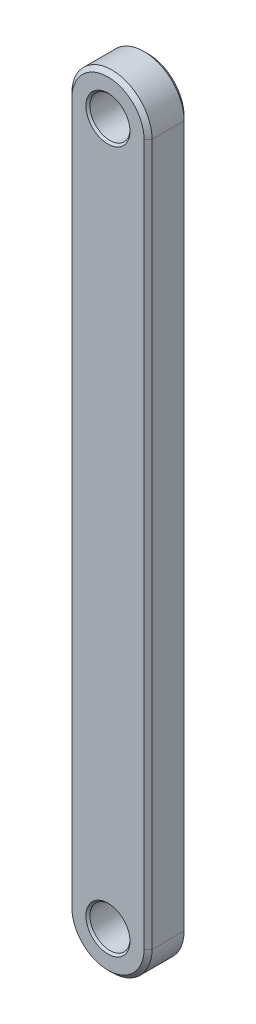
ISO-10303-21;
HEADER;
FILE_DESCRIPTION(('STEP AP214'),'2;1');
FILE_NAME('part.step','',(''),(''),'','','');
FILE_SCHEMA(('AUTOMOTIVE_DESIGN { 1 0 10303 214 1 1 1 1 }'));
ENDSEC;
DATA;
#1=APPLICATION_CONTEXT('core data for automotive mechanical design processes');
#2=APPLICATION_PROTOCOL_DEFINITION('international standard','automotive_design',2000,#1);
#3=PRODUCT_CONTEXT('',#1,'mechanical');
#4=PRODUCT('Part','Part','',(#3));
#5=PRODUCT_RELATED_PRODUCT_CATEGORY('part','',(#4));
#6=PRODUCT_DEFINITION_FORMATION('','',#4);
#7=PRODUCT_DEFINITION_CONTEXT('part definition',#1,'design');
#8=PRODUCT_DEFINITION('design','',#6,#7);
#9=PRODUCT_DEFINITION_SHAPE('','',#8);
#10=(LENGTH_UNIT() NAMED_UNIT(*) SI_UNIT(.MILLI.,.METRE.));
#11=(NAMED_UNIT(*) PLANE_ANGLE_UNIT() SI_UNIT($,.RADIAN.));
#12=(NAMED_UNIT(*) SI_UNIT($,.STERADIAN.) SOLID_ANGLE_UNIT());
#13=UNCERTAINTY_MEASURE_WITH_UNIT(LENGTH_MEASURE(1.E-05),#10,'distance_accuracy_value','');
#14=(GEOMETRIC_REPRESENTATION_CONTEXT(3) GLOBAL_UNCERTAINTY_ASSIGNED_CONTEXT((#13)) GLOBAL_UNIT_ASSIGNED_CONTEXT((#10,
#11,#12)) REPRESENTATION_CONTEXT('',''));
#15=CARTESIAN_POINT('',(0.,0.,0.));
#16=DIRECTION('',(0.,0.,1.));
#17=DIRECTION('',(1.,0.,0.));
#18=AXIS2_PLACEMENT_3D('',#15,#16,#17);
#19=CARTESIAN_POINT('',(0.,-17.5,1.));
#20=DIRECTION('',(0.,0.,1.));
#21=DIRECTION('',(1.,0.,0.));
#22=AXIS2_PLACEMENT_3D('',#19,#20,#21);
#23=PLANE('',#22);
#24=CARTESIAN_POINT('',(0.,-17.5,1.));
#25=DIRECTION('',(0.,0.,1.));
#26=DIRECTION('',(1.,0.,0.));
#27=AXIS2_PLACEMENT_3D('',#24,#25,#26);
#28=CIRCLE('',#27,1.1);
#29=CARTESIAN_POINT('',(1.1,-17.5,1.));
#30=VERTEX_POINT('',#29);
#31=EDGE_CURVE('E160',#30,#30,#28,.F.);
#32=ORIENTED_EDGE('',*,*,#31,.T.);
#33=EDGE_LOOP('',(#32));
#34=FACE_BOUND('',#33,.T.);
#35=CARTESIAN_POINT('',(0.,17.5,1.));
#36=DIRECTION('',(0.,0.,1.));
#37=DIRECTION('',(1.,0.,0.));
#38=AXIS2_PLACEMENT_3D('',#35,#36,#37);
#39=CIRCLE('',#38,1.1);
#40=CARTESIAN_POINT('',(1.1,17.5,1.));
#41=VERTEX_POINT('',#40);
#42=EDGE_CURVE('E157',#41,#41,#39,.F.);
#43=ORIENTED_EDGE('',*,*,#42,.T.);
#44=EDGE_LOOP('',(#43));
#45=FACE_BOUND('',#44,.T.);
#46=CARTESIAN_POINT('',(0.,17.5,1.));
#47=DIRECTION('',(0.,0.,1.));
#48=DIRECTION('',(1.,0.,0.));
#49=AXIS2_PLACEMENT_3D('',#46,#47,#48);
#50=CIRCLE('',#49,1.80000000000001);
#51=CARTESIAN_POINT('',(1.8,17.5,1.));
#52=VERTEX_POINT('',#51);
#53=CARTESIAN_POINT('',(-1.80000000000001,17.5,1.));
#54=VERTEX_POINT('',#53);
#55=EDGE_CURVE('E63',#52,#54,#50,.T.);
#56=ORIENTED_EDGE('',*,*,#55,.T.);
#57=DIRECTION('',(0.,-1.,0.));
#58=VECTOR('',#57,1.);
#59=CARTESIAN_POINT('',(-1.80000000000001,-17.5,1.));
#60=LINE('',#59,#58);
#61=CARTESIAN_POINT('',(-1.80000000000001,-17.5,1.));
#62=VERTEX_POINT('',#61);
#63=EDGE_CURVE('E154',#54,#62,#60,.T.);
#64=ORIENTED_EDGE('',*,*,#63,.T.);
#65=CARTESIAN_POINT('',(0.,-17.5,1.));
#66=DIRECTION('',(0.,0.,1.));
#67=DIRECTION('',(1.,0.,0.));
#68=AXIS2_PLACEMENT_3D('',#65,#66,#67);
#69=CIRCLE('',#68,1.80000000000001);
#70=CARTESIAN_POINT('',(1.80000000000001,-17.5,1.));
#71=VERTEX_POINT('',#70);
#72=EDGE_CURVE('E138',#62,#71,#69,.T.);
#73=ORIENTED_EDGE('',*,*,#72,.T.);
#74=DIRECTION('',(0.,1.,0.));
#75=VECTOR('',#74,1.);
#76=CARTESIAN_POINT('',(1.8,17.5,1.));
#77=LINE('',#76,#75);
#78=EDGE_CURVE('E323',#71,#52,#77,.T.);
#79=ORIENTED_EDGE('',*,*,#78,.T.);
#80=EDGE_LOOP('',(#56,#64,#73,#79));
#81=FACE_BOUND('',#80,.T.);
#82=ADVANCED_FACE('F39',(#34,#45,#81),#23,.T.);
#83=CARTESIAN_POINT('',(0.,-17.5,-1.));
#84=DIRECTION('',(0.,0.,1.));
#85=DIRECTION('',(1.,0.,0.));
#86=AXIS2_PLACEMENT_3D('',#83,#84,#85);
#87=PLANE('',#86);
#88=CARTESIAN_POINT('',(0.,-17.5,-1.));
#89=DIRECTION('',(0.,0.,1.));
#90=DIRECTION('',(1.,0.,0.));
#91=AXIS2_PLACEMENT_3D('',#88,#89,#90);
#92=CIRCLE('',#91,1.1);
#93=CARTESIAN_POINT('',(1.1,-17.5,-1.));
#94=VERTEX_POINT('',#93);
#95=EDGE_CURVE('E166',#94,#94,#92,.T.);
#96=ORIENTED_EDGE('',*,*,#95,.T.);
#97=EDGE_LOOP('',(#96));
#98=FACE_BOUND('',#97,.T.);
#99=CARTESIAN_POINT('',(0.,17.5,-1.));
#100=DIRECTION('',(0.,0.,1.));
#101=DIRECTION('',(1.,0.,0.));
#102=AXIS2_PLACEMENT_3D('',#99,#100,#101);
#103=CIRCLE('',#102,1.1);
#104=CARTESIAN_POINT('',(1.1,17.5,-1.));
#105=VERTEX_POINT('',#104);
#106=EDGE_CURVE('E163',#105,#105,#103,.T.);
#107=ORIENTED_EDGE('',*,*,#106,.T.);
#108=EDGE_LOOP('',(#107));
#109=FACE_BOUND('',#108,.T.);
#110=CARTESIAN_POINT('',(0.,-17.5,-1.));
#111=DIRECTION('',(0.,0.,1.));
#112=DIRECTION('',(1.,0.,0.));
#113=AXIS2_PLACEMENT_3D('',#110,#111,#112);
#114=CIRCLE('',#113,1.80000000000001);
#115=CARTESIAN_POINT('',(1.80000000000001,-17.5,-1.));
#116=VERTEX_POINT('',#115);
#117=CARTESIAN_POINT('',(-1.80000000000001,-17.5,-1.));
#118=VERTEX_POINT('',#117);
#119=EDGE_CURVE('E287',#116,#118,#114,.F.);
#120=ORIENTED_EDGE('',*,*,#119,.T.);
#121=DIRECTION('',(0.,1.,0.));
#122=VECTOR('',#121,1.);
#123=CARTESIAN_POINT('',(-1.80000000000001,-17.5,-1.));
#124=LINE('',#123,#122);
#125=CARTESIAN_POINT('',(-1.80000000000001,17.5,-1.));
#126=VERTEX_POINT('',#125);
#127=EDGE_CURVE('E119',#118,#126,#124,.T.);
#128=ORIENTED_EDGE('',*,*,#127,.T.);
#129=CARTESIAN_POINT('',(0.,17.5,-1.));
#130=DIRECTION('',(0.,0.,1.));
#131=DIRECTION('',(1.,0.,0.));
#132=AXIS2_PLACEMENT_3D('',#129,#130,#131);
#133=CIRCLE('',#132,1.80000000000001);
#134=CARTESIAN_POINT('',(1.8,17.5,-1.));
#135=VERTEX_POINT('',#134);
#136=EDGE_CURVE('E294',#126,#135,#133,.F.);
#137=ORIENTED_EDGE('',*,*,#136,.T.);
#138=DIRECTION('',(0.,-1.,0.));
#139=VECTOR('',#138,1.);
#140=CARTESIAN_POINT('',(1.80000000000001,-17.5,-1.));
#141=LINE('',#140,#139);
#142=EDGE_CURVE('E290',#135,#116,#141,.T.);
#143=ORIENTED_EDGE('',*,*,#142,.T.);
#144=EDGE_LOOP('',(#120,#128,#137,#143));
#145=FACE_BOUND('',#144,.T.);
#146=ADVANCED_FACE('F183',(#98,#109,#145),#87,.F.);
#147=CARTESIAN_POINT('',(0.,-17.5,1.));
#148=DIRECTION('',(0.,0.,-1.));
#149=DIRECTION('',(-1.,0.,0.));
#150=AXIS2_PLACEMENT_3D('',#147,#148,#149);
#151=CYLINDRICAL_SURFACE('',#150,2.00000000000001);
#152=DIRECTION('',(0.,0.,-1.));
#153=VECTOR('',#152,1.);
#154=CARTESIAN_POINT('',(-2.00000000000001,-17.5,1.));
#155=LINE('',#154,#153);
#156=CARTESIAN_POINT('',(-2.00000000000001,-17.5,0.799999999999998));
#157=VERTEX_POINT('',#156);
#158=CARTESIAN_POINT('',(-2.00000000000001,-17.5,-0.799999999999998));
#159=VERTEX_POINT('',#158);
#160=EDGE_CURVE('E112',#157,#159,#155,.T.);
#161=ORIENTED_EDGE('',*,*,#160,.T.);
#162=CARTESIAN_POINT('',(0.,-17.5,-0.799999999999998));
#163=DIRECTION('',(0.,0.,1.));
#164=DIRECTION('',(1.,0.,0.));
#165=AXIS2_PLACEMENT_3D('',#162,#163,#164);
#166=CIRCLE('',#165,2.00000000000001);
#167=CARTESIAN_POINT('',(2.00000000000001,-17.5,-0.799999999999998));
#168=VERTEX_POINT('',#167);
#169=EDGE_CURVE('E118',#159,#168,#166,.T.);
#170=ORIENTED_EDGE('',*,*,#169,.T.);
#171=DIRECTION('',(0.,0.,-1.));
#172=VECTOR('',#171,1.);
#173=CARTESIAN_POINT('',(2.00000000000001,-17.5,1.));
#174=LINE('',#173,#172);
#175=CARTESIAN_POINT('',(2.00000000000001,-17.5,0.799999999999998));
#176=VERTEX_POINT('',#175);
#177=EDGE_CURVE('E114',#176,#168,#174,.T.);
#178=ORIENTED_EDGE('',*,*,#177,.F.);
#179=CARTESIAN_POINT('',(0.,-17.5,0.799999999999998));
#180=DIRECTION('',(0.,0.,1.));
#181=DIRECTION('',(1.,0.,0.));
#182=AXIS2_PLACEMENT_3D('',#179,#180,#181);
#183=CIRCLE('',#182,2.00000000000001);
#184=EDGE_CURVE('E109',#176,#157,#183,.F.);
#185=ORIENTED_EDGE('',*,*,#184,.T.);
#186=EDGE_LOOP('',(#161,#170,#178,#185));
#187=FACE_BOUND('',#186,.T.);
#188=ADVANCED_FACE('F111',(#187),#151,.T.);
#189=CARTESIAN_POINT('',(2.00000000000001,-17.5,1.));
#190=DIRECTION('',(-1.,0.,0.));
#191=DIRECTION('',(0.,-1.,0.));
#192=AXIS2_PLACEMENT_3D('',#189,#190,#191);
#193=PLANE('',#192);
#194=ORIENTED_EDGE('',*,*,#177,.T.);
#195=DIRECTION('',(0.,1.,0.));
#196=VECTOR('',#195,1.);
#197=CARTESIAN_POINT('',(2.00000000000001,-17.5,-0.799999999999998));
#198=LINE('',#197,#196);
#199=CARTESIAN_POINT('',(2.00000000000001,17.5,-0.799999999999998));
#200=VERTEX_POINT('',#199);
#201=EDGE_CURVE('E311',#168,#200,#198,.T.);
#202=ORIENTED_EDGE('',*,*,#201,.T.);
#203=DIRECTION('',(0.,0.,-1.));
#204=VECTOR('',#203,1.);
#205=CARTESIAN_POINT('',(2.00000000000001,17.5,1.));
#206=LINE('',#205,#204);
#207=CARTESIAN_POINT('',(2.00000000000001,17.5,0.799999999999998));
#208=VERTEX_POINT('',#207);
#209=EDGE_CURVE('E330',#208,#200,#206,.T.);
#210=ORIENTED_EDGE('',*,*,#209,.F.);
#211=DIRECTION('',(0.,-1.,0.));
#212=VECTOR('',#211,1.);
#213=CARTESIAN_POINT('',(2.00000000000001,-17.5,0.799999999999998));
#214=LINE('',#213,#212);
#215=EDGE_CURVE('E320',#208,#176,#214,.T.);
#216=ORIENTED_EDGE('',*,*,#215,.T.);
#217=EDGE_LOOP('',(#194,#202,#210,#216));
#218=FACE_BOUND('',#217,.T.);
#219=ADVANCED_FACE('F200',(#218),#193,.F.);
#220=CARTESIAN_POINT('',(0.,17.5,1.));
#221=DIRECTION('',(0.,0.,-1.));
#222=DIRECTION('',(-1.,0.,0.));
#223=AXIS2_PLACEMENT_3D('',#220,#221,#222);
#224=CYLINDRICAL_SURFACE('',#223,2.00000000000001);
#225=ORIENTED_EDGE('',*,*,#209,.T.);
#226=CARTESIAN_POINT('',(0.,17.5,-0.799999999999998));
#227=DIRECTION('',(0.,0.,1.));
#228=DIRECTION('',(1.,0.,0.));
#229=AXIS2_PLACEMENT_3D('',#226,#227,#228);
#230=CIRCLE('',#229,2.00000000000001);
#231=CARTESIAN_POINT('',(-2.00000000000001,17.5,-0.799999999999998));
#232=VERTEX_POINT('',#231);
#233=EDGE_CURVE('E309',#200,#232,#230,.T.);
#234=ORIENTED_EDGE('',*,*,#233,.T.);
#235=DIRECTION('',(0.,0.,-1.));
#236=VECTOR('',#235,1.);
#237=CARTESIAN_POINT('',(-2.00000000000001,17.5,1.));
#238=LINE('',#237,#236);
#239=CARTESIAN_POINT('',(-2.00000000000001,17.5,0.799999999999998));
#240=VERTEX_POINT('',#239);
#241=EDGE_CURVE('E130',#240,#232,#238,.T.);
#242=ORIENTED_EDGE('',*,*,#241,.F.);
#243=CARTESIAN_POINT('',(0.,17.5,0.799999999999998));
#244=DIRECTION('',(0.,0.,1.));
#245=DIRECTION('',(1.,0.,0.));
#246=AXIS2_PLACEMENT_3D('',#243,#244,#245);
#247=CIRCLE('',#246,2.00000000000001);
#248=EDGE_CURVE('E317',#240,#208,#247,.F.);
#249=ORIENTED_EDGE('',*,*,#248,.T.);
#250=EDGE_LOOP('',(#225,#234,#242,#249));
#251=FACE_BOUND('',#250,.T.);
#252=ADVANCED_FACE('F197',(#251),#224,.T.);
#253=CARTESIAN_POINT('',(-2.00000000000001,-17.5,1.));
#254=DIRECTION('',(1.,0.,0.));
#255=DIRECTION('',(0.,1.,0.));
#256=AXIS2_PLACEMENT_3D('',#253,#254,#255);
#257=PLANE('',#256);
#258=ORIENTED_EDGE('',*,*,#241,.T.);
#259=DIRECTION('',(0.,-1.,0.));
#260=VECTOR('',#259,1.);
#261=CARTESIAN_POINT('',(-2.00000000000001,-17.5,-0.799999999999998));
#262=LINE('',#261,#260);
#263=EDGE_CURVE('E129',#232,#159,#262,.T.);
#264=ORIENTED_EDGE('',*,*,#263,.T.);
#265=ORIENTED_EDGE('',*,*,#160,.F.);
#266=DIRECTION('',(0.,1.,0.));
#267=VECTOR('',#266,1.);
#268=CARTESIAN_POINT('',(-2.00000000000001,17.5,0.799999999999998));
#269=LINE('',#268,#267);
#270=EDGE_CURVE('E126',#157,#240,#269,.T.);
#271=ORIENTED_EDGE('',*,*,#270,.T.);
#272=EDGE_LOOP('',(#258,#264,#265,#271));
#273=FACE_BOUND('',#272,.T.);
#274=ADVANCED_FACE('F125',(#273),#257,.F.);
#275=CARTESIAN_POINT('',(0.,17.5,1.));
#276=DIRECTION('',(0.,0.,-1.));
#277=DIRECTION('',(-1.,0.,0.));
#278=AXIS2_PLACEMENT_3D('',#275,#276,#277);
#279=CYLINDRICAL_SURFACE('',#278,1.);
#280=CARTESIAN_POINT('',(0.,17.5,-0.899999999999998));
#281=DIRECTION('',(0.,0.,1.));
#282=DIRECTION('',(1.,0.,0.));
#283=AXIS2_PLACEMENT_3D('',#280,#281,#282);
#284=CIRCLE('',#283,1.);
#285=CARTESIAN_POINT('',(1.,17.5,-0.899999999999998));
#286=VERTEX_POINT('',#285);
#287=EDGE_CURVE('E11',#286,#286,#284,.F.);
#288=ORIENTED_EDGE('',*,*,#287,.T.);
#289=EDGE_LOOP('',(#288));
#290=FACE_BOUND('',#289,.T.);
#291=CARTESIAN_POINT('',(0.,17.5,0.900000000000005));
#292=DIRECTION('',(0.,0.,1.));
#293=DIRECTION('',(1.,0.,0.));
#294=AXIS2_PLACEMENT_3D('',#291,#292,#293);
#295=CIRCLE('',#294,1.);
#296=CARTESIAN_POINT('',(1.,17.5,0.900000000000005));
#297=VERTEX_POINT('',#296);
#298=EDGE_CURVE('E48',#297,#297,#295,.T.);
#299=ORIENTED_EDGE('',*,*,#298,.T.);
#300=EDGE_LOOP('',(#299));
#301=FACE_BOUND('',#300,.T.);
#302=ADVANCED_FACE('F171',(#290,#301),#279,.F.);
#303=CARTESIAN_POINT('',(0.,-17.5,1.));
#304=DIRECTION('',(0.,0.,-1.));
#305=DIRECTION('',(-1.,0.,0.));
#306=AXIS2_PLACEMENT_3D('',#303,#304,#305);
#307=CYLINDRICAL_SURFACE('',#306,1.);
#308=CARTESIAN_POINT('',(0.,-17.5,0.900000000000006));
#309=DIRECTION('',(0.,0.,1.));
#310=DIRECTION('',(1.,0.,0.));
#311=AXIS2_PLACEMENT_3D('',#308,#309,#310);
#312=CIRCLE('',#311,1.);
#313=CARTESIAN_POINT('',(1.,-17.5,0.900000000000006));
#314=VERTEX_POINT('',#313);
#315=EDGE_CURVE('E153',#314,#314,#312,.T.);
#316=ORIENTED_EDGE('',*,*,#315,.T.);
#317=EDGE_LOOP('',(#316));
#318=FACE_BOUND('',#317,.T.);
#319=CARTESIAN_POINT('',(0.,-17.5,-0.899999999999999));
#320=DIRECTION('',(0.,0.,1.));
#321=DIRECTION('',(1.,0.,0.));
#322=AXIS2_PLACEMENT_3D('',#319,#320,#321);
#323=CIRCLE('',#322,1.);
#324=CARTESIAN_POINT('',(1.,-17.5,-0.899999999999999));
#325=VERTEX_POINT('',#324);
#326=EDGE_CURVE('E150',#325,#325,#323,.F.);
#327=ORIENTED_EDGE('',*,*,#326,.T.);
#328=EDGE_LOOP('',(#327));
#329=FACE_BOUND('',#328,.T.);
#330=ADVANCED_FACE('F236',(#318,#329),#307,.F.);
#331=CARTESIAN_POINT('',(2.00000000000001,-17.5,-0.799999999999998));
#332=DIRECTION('',(-0.707106781186554,0.,0.707106781186541));
#333=DIRECTION('',(0.,1.,0.));
#334=AXIS2_PLACEMENT_3D('',#331,#332,#333);
#335=PLANE('',#334);
#336=DIRECTION('',(0.707106781186541,0.,0.707106781186554));
#337=VECTOR('',#336,1.);
#338=CARTESIAN_POINT('',(1.80000000000001,-17.5,-1.));
#339=LINE('',#338,#337);
#340=EDGE_CURVE('E302',#116,#168,#339,.T.);
#341=ORIENTED_EDGE('',*,*,#340,.F.);
#342=ORIENTED_EDGE('',*,*,#142,.F.);
#343=DIRECTION('',(-0.707106781186541,0.,-0.707106781186554));
#344=VECTOR('',#343,1.);
#345=CARTESIAN_POINT('',(2.,17.5,-0.799999999999998));
#346=LINE('',#345,#344);
#347=EDGE_CURVE('E131',#200,#135,#346,.T.);
#348=ORIENTED_EDGE('',*,*,#347,.F.);
#349=ORIENTED_EDGE('',*,*,#201,.F.);
#350=EDGE_LOOP('',(#341,#342,#348,#349));
#351=FACE_BOUND('',#350,.T.);
#352=ADVANCED_FACE('F230',(#351),#335,.F.);
#353=CARTESIAN_POINT('',(0.,17.5,-0.799999999999998));
#354=DIRECTION('',(0.,0.,1.));
#355=DIRECTION('',(1.,0.,0.));
#356=AXIS2_PLACEMENT_3D('',#353,#354,#355);
#357=CONICAL_SURFACE('',#356,2.00000000000001,0.78539816339744);
#358=ORIENTED_EDGE('',*,*,#347,.T.);
#359=ORIENTED_EDGE('',*,*,#136,.F.);
#360=DIRECTION('',(0.707106781186541,0.,-0.707106781186554));
#361=VECTOR('',#360,1.);
#362=CARTESIAN_POINT('',(-2.00000000000001,17.5,-0.799999999999998));
#363=LINE('',#362,#361);
#364=EDGE_CURVE('E298',#232,#126,#363,.T.);
#365=ORIENTED_EDGE('',*,*,#364,.F.);
#366=ORIENTED_EDGE('',*,*,#233,.F.);
#367=EDGE_LOOP('',(#358,#359,#365,#366));
#368=FACE_BOUND('',#367,.T.);
#369=ADVANCED_FACE('F223',(#368),#357,.T.);
#370=CARTESIAN_POINT('',(0.,-17.5,-0.799999999999998));
#371=DIRECTION('',(0.,0.,1.));
#372=DIRECTION('',(1.,0.,0.));
#373=AXIS2_PLACEMENT_3D('',#370,#371,#372);
#374=CONICAL_SURFACE('',#373,2.00000000000001,0.78539816339744);
#375=ORIENTED_EDGE('',*,*,#340,.T.);
#376=ORIENTED_EDGE('',*,*,#169,.F.);
#377=DIRECTION('',(-0.707106781186541,0.,0.707106781186554));
#378=VECTOR('',#377,1.);
#379=CARTESIAN_POINT('',(-1.80000000000001,-17.5,-1.));
#380=LINE('',#379,#378);
#381=EDGE_CURVE('E149',#118,#159,#380,.T.);
#382=ORIENTED_EDGE('',*,*,#381,.F.);
#383=ORIENTED_EDGE('',*,*,#119,.F.);
#384=EDGE_LOOP('',(#375,#376,#382,#383));
#385=FACE_BOUND('',#384,.T.);
#386=ADVANCED_FACE('F216',(#385),#374,.T.);
#387=CARTESIAN_POINT('',(-2.00000000000001,-17.5,-0.799999999999998));
#388=DIRECTION('',(0.707106781186554,0.,0.707106781186541));
#389=DIRECTION('',(0.,-1.,0.));
#390=AXIS2_PLACEMENT_3D('',#387,#388,#389);
#391=PLANE('',#390);
#392=ORIENTED_EDGE('',*,*,#364,.T.);
#393=ORIENTED_EDGE('',*,*,#127,.F.);
#394=ORIENTED_EDGE('',*,*,#381,.T.);
#395=ORIENTED_EDGE('',*,*,#263,.F.);
#396=EDGE_LOOP('',(#392,#393,#394,#395));
#397=FACE_BOUND('',#396,.T.);
#398=ADVANCED_FACE('F208',(#397),#391,.F.);
#399=CARTESIAN_POINT('',(1.80000000000001,-17.5,1.));
#400=DIRECTION('',(0.707106781186554,0.,0.707106781186541));
#401=DIRECTION('',(0.,-1.,0.));
#402=AXIS2_PLACEMENT_3D('',#399,#400,#401);
#403=PLANE('',#402);
#404=DIRECTION('',(-0.707106781186541,0.,0.707106781186554));
#405=VECTOR('',#404,1.);
#406=CARTESIAN_POINT('',(2.00000000000001,-17.5,0.799999999999998));
#407=LINE('',#406,#405);
#408=EDGE_CURVE('E140',#176,#71,#407,.T.);
#409=ORIENTED_EDGE('',*,*,#408,.F.);
#410=ORIENTED_EDGE('',*,*,#215,.F.);
#411=DIRECTION('',(0.707106781186541,0.,-0.707106781186554));
#412=VECTOR('',#411,1.);
#413=CARTESIAN_POINT('',(1.8,17.5,1.));
#414=LINE('',#413,#412);
#415=EDGE_CURVE('E146',#52,#208,#414,.T.);
#416=ORIENTED_EDGE('',*,*,#415,.F.);
#417=ORIENTED_EDGE('',*,*,#78,.F.);
#418=EDGE_LOOP('',(#409,#410,#416,#417));
#419=FACE_BOUND('',#418,.T.);
#420=ADVANCED_FACE('F215',(#419),#403,.T.);
#421=CARTESIAN_POINT('',(0.,17.5,1.));
#422=DIRECTION('',(0.,0.,-1.));
#423=DIRECTION('',(-1.,0.,0.));
#424=AXIS2_PLACEMENT_3D('',#421,#422,#423);
#425=CONICAL_SURFACE('',#424,1.80000000000001,0.78539816339744);
#426=ORIENTED_EDGE('',*,*,#415,.T.);
#427=ORIENTED_EDGE('',*,*,#248,.F.);
#428=DIRECTION('',(-0.707106781186541,0.,-0.707106781186554));
#429=VECTOR('',#428,1.);
#430=CARTESIAN_POINT('',(-1.80000000000001,17.5,1.));
#431=LINE('',#430,#429);
#432=EDGE_CURVE('E134',#54,#240,#431,.T.);
#433=ORIENTED_EDGE('',*,*,#432,.F.);
#434=ORIENTED_EDGE('',*,*,#55,.F.);
#435=EDGE_LOOP('',(#426,#427,#433,#434));
#436=FACE_BOUND('',#435,.T.);
#437=ADVANCED_FACE('F251',(#436),#425,.T.);
#438=CARTESIAN_POINT('',(0.,-17.5,1.));
#439=DIRECTION('',(0.,0.,-1.));
#440=DIRECTION('',(-1.,0.,0.));
#441=AXIS2_PLACEMENT_3D('',#438,#439,#440);
#442=CONICAL_SURFACE('',#441,1.80000000000001,0.78539816339744);
#443=ORIENTED_EDGE('',*,*,#408,.T.);
#444=ORIENTED_EDGE('',*,*,#72,.F.);
#445=DIRECTION('',(0.707106781186541,0.,0.707106781186554));
#446=VECTOR('',#445,1.);
#447=CARTESIAN_POINT('',(-2.00000000000001,-17.5,0.799999999999998));
#448=LINE('',#447,#446);
#449=EDGE_CURVE('E55',#157,#62,#448,.T.);
#450=ORIENTED_EDGE('',*,*,#449,.F.);
#451=ORIENTED_EDGE('',*,*,#184,.F.);
#452=EDGE_LOOP('',(#443,#444,#450,#451));
#453=FACE_BOUND('',#452,.T.);
#454=ADVANCED_FACE('F137',(#453),#442,.T.);
#455=CARTESIAN_POINT('',(-1.80000000000001,-17.5,1.));
#456=DIRECTION('',(-0.707106781186554,0.,0.707106781186541));
#457=DIRECTION('',(0.,1.,0.));
#458=AXIS2_PLACEMENT_3D('',#455,#456,#457);
#459=PLANE('',#458);
#460=ORIENTED_EDGE('',*,*,#432,.T.);
#461=ORIENTED_EDGE('',*,*,#270,.F.);
#462=ORIENTED_EDGE('',*,*,#449,.T.);
#463=ORIENTED_EDGE('',*,*,#63,.F.);
#464=EDGE_LOOP('',(#460,#461,#462,#463));
#465=FACE_BOUND('',#464,.T.);
#466=ADVANCED_FACE('F133',(#465),#459,.T.);
#467=CARTESIAN_POINT('',(0.,-17.5,0.900000000000006));
#468=DIRECTION('',(0.,0.,1.));
#469=DIRECTION('',(1.,0.,0.));
#470=AXIS2_PLACEMENT_3D('',#467,#468,#469);
#471=CONICAL_SURFACE('',#470,1.,0.785398163397457);
#472=CARTESIAN_POINT('',(1.1,-17.5,1.));
#473=CARTESIAN_POINT('',(1.09895833333333,-17.5,0.998958333333333));
#474=CARTESIAN_POINT('',(1.09791666666666,-17.5,0.997916666666667));
#475=CARTESIAN_POINT('',(1.09583333333333,-17.5,0.995833333333334));
#476=CARTESIAN_POINT('',(1.09479166666666,-17.5,0.994791666666667));
#477=CARTESIAN_POINT('',(1.09270833333333,-17.5,0.992708333333334));
#478=CARTESIAN_POINT('',(1.09166666666666,-17.5,0.991666666666667));
#479=CARTESIAN_POINT('',(1.08958333333333,-17.5,0.989583333333334));
#480=CARTESIAN_POINT('',(1.08854166666666,-17.5,0.988541666666667));
#481=CARTESIAN_POINT('',(1.08645833333333,-17.5,0.986458333333334));
#482=CARTESIAN_POINT('',(1.08541666666666,-17.5,0.985416666666667));
#483=CARTESIAN_POINT('',(1.08333333333333,-17.5,0.983333333333334));
#484=CARTESIAN_POINT('',(1.08229166666666,-17.5,0.982291666666668));
#485=CARTESIAN_POINT('',(1.08020833333333,-17.5,0.980208333333334));
#486=CARTESIAN_POINT('',(1.07916666666666,-17.5,0.979166666666668));
#487=CARTESIAN_POINT('',(1.07708333333333,-17.5,0.977083333333335));
#488=CARTESIAN_POINT('',(1.07604166666666,-17.5,0.976041666666668));
#489=CARTESIAN_POINT('',(1.07395833333333,-17.5,0.973958333333335));
#490=CARTESIAN_POINT('',(1.07291666666666,-17.5,0.972916666666668));
#491=CARTESIAN_POINT('',(1.07083333333333,-17.5,0.970833333333335));
#492=CARTESIAN_POINT('',(1.06979166666666,-17.5,0.969791666666668));
#493=CARTESIAN_POINT('',(1.06770833333333,-17.5,0.967708333333335));
#494=CARTESIAN_POINT('',(1.06666666666666,-17.5,0.966666666666668));
#495=CARTESIAN_POINT('',(1.06458333333333,-17.5,0.964583333333335));
#496=CARTESIAN_POINT('',(1.06354166666666,-17.5,0.963541666666669));
#497=CARTESIAN_POINT('',(1.06145833333333,-17.5,0.961458333333335));
#498=CARTESIAN_POINT('',(1.06041666666666,-17.5,0.960416666666669));
#499=CARTESIAN_POINT('',(1.05833333333333,-17.5,0.958333333333336));
#500=CARTESIAN_POINT('',(1.05729166666666,-17.5,0.957291666666669));
#501=CARTESIAN_POINT('',(1.05520833333333,-17.5,0.955208333333336));
#502=CARTESIAN_POINT('',(1.05416666666667,-17.5,0.954166666666669));
#503=CARTESIAN_POINT('',(1.05208333333333,-17.5,0.952083333333336));
#504=CARTESIAN_POINT('',(1.05104166666667,-17.5,0.951041666666669));
#505=CARTESIAN_POINT('',(1.04895833333333,-17.5,0.948958333333336));
#506=CARTESIAN_POINT('',(1.04791666666667,-17.5,0.94791666666667));
#507=CARTESIAN_POINT('',(1.04583333333333,-17.5,0.945833333333336));
#508=CARTESIAN_POINT('',(1.04479166666667,-17.5,0.94479166666667));
#509=CARTESIAN_POINT('',(1.04270833333333,-17.5,0.942708333333336));
#510=CARTESIAN_POINT('',(1.04166666666667,-17.5,0.94166666666667));
#511=CARTESIAN_POINT('',(1.03958333333333,-17.5,0.939583333333337));
#512=CARTESIAN_POINT('',(1.03854166666667,-17.5,0.93854166666667));
#513=CARTESIAN_POINT('',(1.03645833333333,-17.5,0.936458333333337));
#514=CARTESIAN_POINT('',(1.03541666666667,-17.5,0.93541666666667));
#515=CARTESIAN_POINT('',(1.03333333333333,-17.5,0.933333333333337));
#516=CARTESIAN_POINT('',(1.03229166666667,-17.5,0.93229166666667));
#517=CARTESIAN_POINT('',(1.03020833333333,-17.5,0.930208333333337));
#518=CARTESIAN_POINT('',(1.02916666666667,-17.5,0.929166666666671));
#519=CARTESIAN_POINT('',(1.02708333333333,-17.5,0.927083333333337));
#520=CARTESIAN_POINT('',(1.02604166666667,-17.5,0.926041666666671));
#521=CARTESIAN_POINT('',(1.02395833333333,-17.5,0.923958333333338));
#522=CARTESIAN_POINT('',(1.02291666666667,-17.5,0.922916666666671));
#523=CARTESIAN_POINT('',(1.02083333333333,-17.5,0.920833333333338));
#524=CARTESIAN_POINT('',(1.01979166666667,-17.5,0.919791666666671));
#525=CARTESIAN_POINT('',(1.01770833333333,-17.5,0.917708333333338));
#526=CARTESIAN_POINT('',(1.01666666666667,-17.5,0.916666666666671));
#527=CARTESIAN_POINT('',(1.01458333333333,-17.5,0.914583333333338));
#528=CARTESIAN_POINT('',(1.01354166666667,-17.5,0.913541666666671));
#529=CARTESIAN_POINT('',(1.01145833333333,-17.5,0.911458333333338));
#530=CARTESIAN_POINT('',(1.01041666666667,-17.5,0.910416666666672));
#531=CARTESIAN_POINT('',(1.00833333333333,-17.5,0.908333333333338));
#532=CARTESIAN_POINT('',(1.00729166666667,-17.5,0.907291666666672));
#533=CARTESIAN_POINT('',(1.00520833333333,-17.5,0.905208333333339));
#534=CARTESIAN_POINT('',(1.00416666666667,-17.5,0.904166666666672));
#535=CARTESIAN_POINT('',(1.00208333333333,-17.5,0.902083333333339));
#536=CARTESIAN_POINT('',(1.00104166666667,-17.5,0.901041666666672));
#537=CARTESIAN_POINT('',(1.,-17.5,0.900000000000006));
#538=B_SPLINE_CURVE_WITH_KNOTS('',3,(#472,#473,#474,#475,#476,#477,#478,#479,#480,#481,#482,
#483,#484,#485,#486,#487,#488,#489,#490,#491,#492,#493,#494,#495,#496,#497,#498,#499,#500,#501,
#502,#503,#504,#505,#506,#507,#508,#509,#510,#511,#512,#513,#514,#515,#516,#517,#518,#519,#520,
#521,#522,#523,#524,#525,#526,#527,#528,#529,#530,#531,#532,#533,#534,#535,#536,#537),
.UNSPECIFIED.,.F.,.F.,(4,2,2,2,2,2,2,2,2,2,2,2,2,2,2,2,2,2,2,2,2,2,2,2,2,2,2,2,2,2,2,2,4),(0.,
0.00441941738241574,0.00883883476483148,0.0132582521472472,0.017677669529663,0.0220970869120786,
0.0265165042944943,0.03093592167691,0.0353553390593258,0.0397747564417415,0.0441941738241572,
0.0486135912065729,0.0530330085889886,0.0574524259714043,0.06187184335382,0.0662912607362357,
0.0707106781186514,0.0751300955010671,0.0795495128834828,0.0839689302658985,0.0883883476483142,
0.09280776503073,0.0972271824131457,0.101646599795561,0.106066017177977,0.110485434560393,
0.114904851942808,0.119324269325224,0.12374368670764,0.128163104090056,0.132582521472471,
0.137001938854887,0.141421356237303),.UNSPECIFIED.);
#539=EDGE_CURVE('BSEAM245',#30,#314,#538,.T.);
#540=ORIENTED_EDGE('',*,*,#31,.F.);
#541=ORIENTED_EDGE('',*,*,#315,.F.);
#542=ORIENTED_EDGE('',*,*,#539,.T.);
#543=ORIENTED_EDGE('',*,*,#539,.F.);
#544=EDGE_LOOP('',(#540,#542,#541,#543));
#545=FACE_BOUND('',#544,.T.);
#546=ADVANCED_FACE('F245',(#545),#471,.F.);
#547=CARTESIAN_POINT('',(0.,-17.5,-1.));
#548=DIRECTION('',(0.,0.,-1.));
#549=DIRECTION('',(-1.,0.,0.));
#550=AXIS2_PLACEMENT_3D('',#547,#548,#549);
#551=CONICAL_SURFACE('',#550,1.1,0.78539816339744);
#552=ORIENTED_EDGE('',*,*,#326,.F.);
#553=EDGE_LOOP('',(#552));
#554=FACE_BOUND('',#553,.T.);
#555=ORIENTED_EDGE('',*,*,#95,.F.);
#556=EDGE_LOOP('',(#555));
#557=FACE_BOUND('',#556,.T.);
#558=ADVANCED_FACE('F179',(#554,#557),#551,.F.);
#559=CARTESIAN_POINT('',(0.,17.5,-1.));
#560=DIRECTION('',(0.,0.,-1.));
#561=DIRECTION('',(-1.,0.,0.));
#562=AXIS2_PLACEMENT_3D('',#559,#560,#561);
#563=CONICAL_SURFACE('',#562,1.1,0.785398163397441);
#564=ORIENTED_EDGE('',*,*,#287,.F.);
#565=EDGE_LOOP('',(#564));
#566=FACE_BOUND('',#565,.T.);
#567=ORIENTED_EDGE('',*,*,#106,.F.);
#568=EDGE_LOOP('',(#567));
#569=FACE_BOUND('',#568,.T.);
#570=ADVANCED_FACE('F174',(#566,#569),#563,.F.);
#571=CARTESIAN_POINT('',(0.,17.5,0.900000000000005));
#572=DIRECTION('',(0.,0.,1.));
#573=DIRECTION('',(1.,0.,0.));
#574=AXIS2_PLACEMENT_3D('',#571,#572,#573);
#575=CONICAL_SURFACE('',#574,1.,0.785398163397457);
#576=ORIENTED_EDGE('',*,*,#42,.F.);
#577=EDGE_LOOP('',(#576));
#578=FACE_BOUND('',#577,.T.);
#579=ORIENTED_EDGE('',*,*,#298,.F.);
#580=EDGE_LOOP('',(#579));
#581=FACE_BOUND('',#580,.T.);
#582=ADVANCED_FACE('F42',(#578,#581),#575,.F.);
#583=CLOSED_SHELL('',(#82,#146,#188,#219,#252,#274,#302,#330,#352,#369,#386,#398,#420,#437,#454,
#466,#546,#558,#570,#582));
#584=MANIFOLD_SOLID_BREP('B2',#583);
#585=ADVANCED_BREP_SHAPE_REPRESENTATION('',(#18,#584),#14);
#586=SHAPE_DEFINITION_REPRESENTATION(#9,#585);
ENDSEC;
END-ISO-10303-21;
